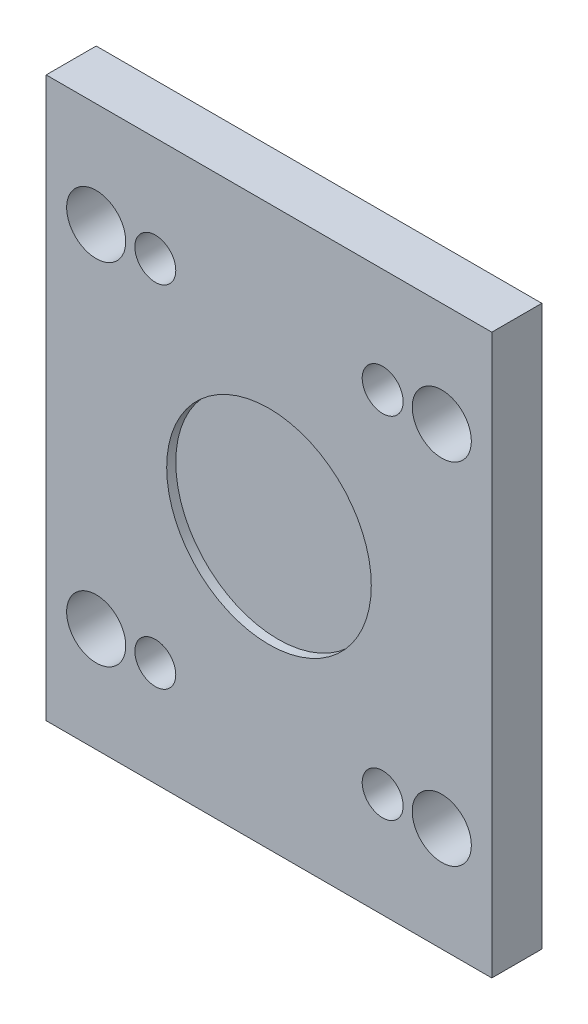
ISO-10303-21;
HEADER;
FILE_DESCRIPTION(('STEP AP214'),'2;1');
FILE_NAME('part.step','',(''),(''),'','','');
FILE_SCHEMA(('AUTOMOTIVE_DESIGN { 1 0 10303 214 1 1 1 1 }'));
ENDSEC;
DATA;
#1=APPLICATION_CONTEXT('core data for automotive mechanical design processes');
#2=APPLICATION_PROTOCOL_DEFINITION('international standard','automotive_design',2000,#1);
#3=PRODUCT_CONTEXT('',#1,'mechanical');
#4=PRODUCT('Part','Part','',(#3));
#5=PRODUCT_RELATED_PRODUCT_CATEGORY('part','',(#4));
#6=PRODUCT_DEFINITION_FORMATION('','',#4);
#7=PRODUCT_DEFINITION_CONTEXT('part definition',#1,'design');
#8=PRODUCT_DEFINITION('design','',#6,#7);
#9=PRODUCT_DEFINITION_SHAPE('','',#8);
#10=(LENGTH_UNIT() NAMED_UNIT(*) SI_UNIT(.MILLI.,.METRE.));
#11=(NAMED_UNIT(*) PLANE_ANGLE_UNIT() SI_UNIT($,.RADIAN.));
#12=(NAMED_UNIT(*) SI_UNIT($,.STERADIAN.) SOLID_ANGLE_UNIT());
#13=UNCERTAINTY_MEASURE_WITH_UNIT(LENGTH_MEASURE(1.E-05),#10,'distance_accuracy_value','');
#14=(GEOMETRIC_REPRESENTATION_CONTEXT(3) GLOBAL_UNCERTAINTY_ASSIGNED_CONTEXT((#13)) GLOBAL_UNIT_ASSIGNED_CONTEXT((#10,
#11,#12)) REPRESENTATION_CONTEXT('',''));
#15=CARTESIAN_POINT('',(0.,0.,0.));
#16=DIRECTION('',(0.,0.,1.));
#17=DIRECTION('',(1.,0.,0.));
#18=AXIS2_PLACEMENT_3D('',#15,#16,#17);
#19=CARTESIAN_POINT('',(98.,-123.,0.));
#20=DIRECTION('',(1.,0.,0.));
#21=DIRECTION('',(0.,0.,-1.));
#22=AXIS2_PLACEMENT_3D('',#19,#20,#21);
#23=PLANE('',#22);
#24=DIRECTION('',(0.,1.,0.));
#25=VECTOR('',#24,1.);
#26=CARTESIAN_POINT('',(98.,-123.,22.));
#27=LINE('',#26,#25);
#28=CARTESIAN_POINT('',(98.,-123.,22.));
#29=VERTEX_POINT('',#28);
#30=CARTESIAN_POINT('',(98.,123.,22.));
#31=VERTEX_POINT('',#30);
#32=EDGE_CURVE('E102',#29,#31,#27,.T.);
#33=ORIENTED_EDGE('',*,*,#32,.F.);
#34=DIRECTION('',(0.,0.,1.));
#35=VECTOR('',#34,1.);
#36=CARTESIAN_POINT('',(98.,-123.,0.));
#37=LINE('',#36,#35);
#38=CARTESIAN_POINT('',(98.,-123.,0.));
#39=VERTEX_POINT('',#38);
#40=EDGE_CURVE('E11',#39,#29,#37,.T.);
#41=ORIENTED_EDGE('',*,*,#40,.F.);
#42=DIRECTION('',(0.,1.,0.));
#43=VECTOR('',#42,1.);
#44=CARTESIAN_POINT('',(98.,-123.,0.));
#45=LINE('',#44,#43);
#46=CARTESIAN_POINT('',(98.,123.,0.));
#47=VERTEX_POINT('',#46);
#48=EDGE_CURVE('E95',#39,#47,#45,.T.);
#49=ORIENTED_EDGE('',*,*,#48,.T.);
#50=DIRECTION('',(0.,0.,1.));
#51=VECTOR('',#50,1.);
#52=CARTESIAN_POINT('',(98.,123.,0.));
#53=LINE('',#52,#51);
#54=EDGE_CURVE('E40',#47,#31,#53,.T.);
#55=ORIENTED_EDGE('',*,*,#54,.T.);
#56=EDGE_LOOP('',(#33,#41,#49,#55));
#57=FACE_BOUND('',#56,.T.);
#58=ADVANCED_FACE('F37',(#57),#23,.T.);
#59=CARTESIAN_POINT('',(-98.,-123.,0.));
#60=DIRECTION('',(0.,-1.,0.));
#61=DIRECTION('',(0.,0.,-1.));
#62=AXIS2_PLACEMENT_3D('',#59,#60,#61);
#63=PLANE('',#62);
#64=DIRECTION('',(1.,0.,0.));
#65=VECTOR('',#64,1.);
#66=CARTESIAN_POINT('',(-98.,-123.,22.));
#67=LINE('',#66,#65);
#68=CARTESIAN_POINT('',(-98.,-123.,22.));
#69=VERTEX_POINT('',#68);
#70=EDGE_CURVE('E97',#69,#29,#67,.T.);
#71=ORIENTED_EDGE('',*,*,#70,.F.);
#72=DIRECTION('',(0.,0.,1.));
#73=VECTOR('',#72,1.);
#74=CARTESIAN_POINT('',(-98.,-123.,0.));
#75=LINE('',#74,#73);
#76=CARTESIAN_POINT('',(-98.,-123.,0.));
#77=VERTEX_POINT('',#76);
#78=EDGE_CURVE('E46',#77,#69,#75,.T.);
#79=ORIENTED_EDGE('',*,*,#78,.F.);
#80=DIRECTION('',(1.,0.,0.));
#81=VECTOR('',#80,1.);
#82=CARTESIAN_POINT('',(-98.,-123.,0.));
#83=LINE('',#82,#81);
#84=EDGE_CURVE('E92',#77,#39,#83,.T.);
#85=ORIENTED_EDGE('',*,*,#84,.T.);
#86=ORIENTED_EDGE('',*,*,#40,.T.);
#87=EDGE_LOOP('',(#71,#79,#85,#86));
#88=FACE_BOUND('',#87,.T.);
#89=ADVANCED_FACE('F113',(#88),#63,.T.);
#90=CARTESIAN_POINT('',(-98.,123.,0.));
#91=DIRECTION('',(-1.,0.,0.));
#92=DIRECTION('',(0.,0.,1.));
#93=AXIS2_PLACEMENT_3D('',#90,#91,#92);
#94=PLANE('',#93);
#95=DIRECTION('',(0.,-1.,0.));
#96=VECTOR('',#95,1.);
#97=CARTESIAN_POINT('',(-98.,123.,22.));
#98=LINE('',#97,#96);
#99=CARTESIAN_POINT('',(-98.,123.,22.));
#100=VERTEX_POINT('',#99);
#101=EDGE_CURVE('E87',#100,#69,#98,.T.);
#102=ORIENTED_EDGE('',*,*,#101,.F.);
#103=DIRECTION('',(0.,0.,1.));
#104=VECTOR('',#103,1.);
#105=CARTESIAN_POINT('',(-98.,123.,0.));
#106=LINE('',#105,#104);
#107=CARTESIAN_POINT('',(-98.,123.,0.));
#108=VERTEX_POINT('',#107);
#109=EDGE_CURVE('E82',#108,#100,#106,.T.);
#110=ORIENTED_EDGE('',*,*,#109,.F.);
#111=DIRECTION('',(0.,-1.,0.));
#112=VECTOR('',#111,1.);
#113=CARTESIAN_POINT('',(-98.,123.,0.));
#114=LINE('',#113,#112);
#115=EDGE_CURVE('E85',#108,#77,#114,.T.);
#116=ORIENTED_EDGE('',*,*,#115,.T.);
#117=ORIENTED_EDGE('',*,*,#78,.T.);
#118=EDGE_LOOP('',(#102,#110,#116,#117));
#119=FACE_BOUND('',#118,.T.);
#120=ADVANCED_FACE('F84',(#119),#94,.T.);
#121=CARTESIAN_POINT('',(98.,123.,0.));
#122=DIRECTION('',(0.,1.,0.));
#123=DIRECTION('',(0.,0.,1.));
#124=AXIS2_PLACEMENT_3D('',#121,#122,#123);
#125=PLANE('',#124);
#126=DIRECTION('',(-1.,0.,0.));
#127=VECTOR('',#126,1.);
#128=CARTESIAN_POINT('',(98.,123.,22.));
#129=LINE('',#128,#127);
#130=EDGE_CURVE('E105',#31,#100,#129,.T.);
#131=ORIENTED_EDGE('',*,*,#130,.F.);
#132=ORIENTED_EDGE('',*,*,#54,.F.);
#133=DIRECTION('',(-1.,0.,0.));
#134=VECTOR('',#133,1.);
#135=CARTESIAN_POINT('',(98.,123.,0.));
#136=LINE('',#135,#134);
#137=EDGE_CURVE('E91',#47,#108,#136,.T.);
#138=ORIENTED_EDGE('',*,*,#137,.T.);
#139=ORIENTED_EDGE('',*,*,#109,.T.);
#140=EDGE_LOOP('',(#131,#132,#138,#139));
#141=FACE_BOUND('',#140,.T.);
#142=ADVANCED_FACE('F94',(#141),#125,.T.);
#143=CARTESIAN_POINT('',(0.,0.,0.));
#144=DIRECTION('',(0.,0.,1.));
#145=DIRECTION('',(1.,0.,0.));
#146=AXIS2_PLACEMENT_3D('',#143,#144,#145);
#147=PLANE('',#146);
#148=CARTESIAN_POINT('',(76.,77.,0.));
#149=DIRECTION('',(0.,0.,1.));
#150=DIRECTION('',(1.,0.,0.));
#151=AXIS2_PLACEMENT_3D('',#148,#149,#150);
#152=CIRCLE('',#151,13.);
#153=CARTESIAN_POINT('',(89.,77.,0.));
#154=VERTEX_POINT('',#153);
#155=EDGE_CURVE('E221',#154,#154,#152,.T.);
#156=ORIENTED_EDGE('',*,*,#155,.T.);
#157=EDGE_LOOP('',(#156));
#158=FACE_BOUND('',#157,.T.);
#159=CARTESIAN_POINT('',(76.,-77.,0.));
#160=DIRECTION('',(0.,0.,1.));
#161=DIRECTION('',(1.,0.,0.));
#162=AXIS2_PLACEMENT_3D('',#159,#160,#161);
#163=CIRCLE('',#162,13.);
#164=CARTESIAN_POINT('',(89.,-77.,0.));
#165=VERTEX_POINT('',#164);
#166=EDGE_CURVE('E226',#165,#165,#163,.T.);
#167=ORIENTED_EDGE('',*,*,#166,.T.);
#168=EDGE_LOOP('',(#167));
#169=FACE_BOUND('',#168,.T.);
#170=CARTESIAN_POINT('',(-76.,-77.,0.));
#171=DIRECTION('',(0.,0.,1.));
#172=DIRECTION('',(1.,0.,0.));
#173=AXIS2_PLACEMENT_3D('',#170,#171,#172);
#174=CIRCLE('',#173,13.);
#175=CARTESIAN_POINT('',(-63.,-77.,0.));
#176=VERTEX_POINT('',#175);
#177=EDGE_CURVE('E232',#176,#176,#174,.T.);
#178=ORIENTED_EDGE('',*,*,#177,.T.);
#179=EDGE_LOOP('',(#178));
#180=FACE_BOUND('',#179,.T.);
#181=CARTESIAN_POINT('',(-76.,77.,0.));
#182=DIRECTION('',(0.,0.,1.));
#183=DIRECTION('',(1.,0.,0.));
#184=AXIS2_PLACEMENT_3D('',#181,#182,#183);
#185=CIRCLE('',#184,13.);
#186=CARTESIAN_POINT('',(-63.,77.,0.));
#187=VERTEX_POINT('',#186);
#188=EDGE_CURVE('E238',#187,#187,#185,.T.);
#189=ORIENTED_EDGE('',*,*,#188,.T.);
#190=EDGE_LOOP('',(#189));
#191=FACE_BOUND('',#190,.T.);
#192=CARTESIAN_POINT('',(50.,77.,0.));
#193=DIRECTION('',(0.,0.,1.));
#194=DIRECTION('',(1.,0.,0.));
#195=AXIS2_PLACEMENT_3D('',#192,#193,#194);
#196=CIRCLE('',#195,5.50000000000001);
#197=CARTESIAN_POINT('',(55.5,77.,0.));
#198=VERTEX_POINT('',#197);
#199=EDGE_CURVE('E250',#198,#198,#196,.T.);
#200=ORIENTED_EDGE('',*,*,#199,.T.);
#201=EDGE_LOOP('',(#200));
#202=FACE_BOUND('',#201,.T.);
#203=CARTESIAN_POINT('',(50.,-77.,0.));
#204=DIRECTION('',(0.,0.,1.));
#205=DIRECTION('',(1.,0.,0.));
#206=AXIS2_PLACEMENT_3D('',#203,#204,#205);
#207=CIRCLE('',#206,5.50000000000001);
#208=CARTESIAN_POINT('',(55.5,-77.,0.));
#209=VERTEX_POINT('',#208);
#210=EDGE_CURVE('E262',#209,#209,#207,.T.);
#211=ORIENTED_EDGE('',*,*,#210,.T.);
#212=EDGE_LOOP('',(#211));
#213=FACE_BOUND('',#212,.T.);
#214=CARTESIAN_POINT('',(-50.,77.,0.));
#215=DIRECTION('',(0.,0.,1.));
#216=DIRECTION('',(1.,0.,0.));
#217=AXIS2_PLACEMENT_3D('',#214,#215,#216);
#218=CIRCLE('',#217,5.50000000000001);
#219=CARTESIAN_POINT('',(-44.5,77.,0.));
#220=VERTEX_POINT('',#219);
#221=EDGE_CURVE('E274',#220,#220,#218,.T.);
#222=ORIENTED_EDGE('',*,*,#221,.T.);
#223=EDGE_LOOP('',(#222));
#224=FACE_BOUND('',#223,.T.);
#225=CARTESIAN_POINT('',(-50.,-77.,0.));
#226=DIRECTION('',(0.,0.,1.));
#227=DIRECTION('',(1.,0.,0.));
#228=AXIS2_PLACEMENT_3D('',#225,#226,#227);
#229=CIRCLE('',#228,5.50000000000001);
#230=CARTESIAN_POINT('',(-44.5,-77.,0.));
#231=VERTEX_POINT('',#230);
#232=EDGE_CURVE('E106',#231,#231,#229,.T.);
#233=ORIENTED_EDGE('',*,*,#232,.T.);
#234=EDGE_LOOP('',(#233));
#235=FACE_BOUND('',#234,.T.);
#236=ORIENTED_EDGE('',*,*,#48,.F.);
#237=ORIENTED_EDGE('',*,*,#84,.F.);
#238=ORIENTED_EDGE('',*,*,#115,.F.);
#239=ORIENTED_EDGE('',*,*,#137,.F.);
#240=EDGE_LOOP('',(#236,#237,#238,#239));
#241=FACE_BOUND('',#240,.T.);
#242=ADVANCED_FACE('F90',(#158,#169,#180,#191,#202,#213,#224,#235,#241),#147,.F.);
#243=CARTESIAN_POINT('',(0.,0.,22.));
#244=DIRECTION('',(0.,0.,1.));
#245=DIRECTION('',(1.,0.,0.));
#246=AXIS2_PLACEMENT_3D('',#243,#244,#245);
#247=PLANE('',#246);
#248=CARTESIAN_POINT('',(0.,0.,22.));
#249=DIRECTION('',(0.,0.,1.));
#250=DIRECTION('',(1.,0.,0.));
#251=AXIS2_PLACEMENT_3D('',#248,#249,#250);
#252=CIRCLE('',#251,45.);
#253=CARTESIAN_POINT('',(45.,0.,22.));
#254=VERTEX_POINT('',#253);
#255=EDGE_CURVE('E214',#254,#254,#252,.T.);
#256=ORIENTED_EDGE('',*,*,#255,.F.);
#257=EDGE_LOOP('',(#256));
#258=FACE_BOUND('',#257,.T.);
#259=CARTESIAN_POINT('',(76.,77.,22.));
#260=DIRECTION('',(0.,0.,1.));
#261=DIRECTION('',(1.,0.,0.));
#262=AXIS2_PLACEMENT_3D('',#259,#260,#261);
#263=CIRCLE('',#262,13.);
#264=CARTESIAN_POINT('',(89.,77.,22.));
#265=VERTEX_POINT('',#264);
#266=EDGE_CURVE('E216',#265,#265,#263,.T.);
#267=ORIENTED_EDGE('',*,*,#266,.F.);
#268=EDGE_LOOP('',(#267));
#269=FACE_BOUND('',#268,.T.);
#270=CARTESIAN_POINT('',(76.,-77.,22.));
#271=DIRECTION('',(0.,0.,1.));
#272=DIRECTION('',(1.,0.,0.));
#273=AXIS2_PLACEMENT_3D('',#270,#271,#272);
#274=CIRCLE('',#273,13.);
#275=CARTESIAN_POINT('',(89.,-77.,22.));
#276=VERTEX_POINT('',#275);
#277=EDGE_CURVE('E223',#276,#276,#274,.T.);
#278=ORIENTED_EDGE('',*,*,#277,.F.);
#279=EDGE_LOOP('',(#278));
#280=FACE_BOUND('',#279,.T.);
#281=CARTESIAN_POINT('',(-76.,-77.,22.));
#282=DIRECTION('',(0.,0.,1.));
#283=DIRECTION('',(1.,0.,0.));
#284=AXIS2_PLACEMENT_3D('',#281,#282,#283);
#285=CIRCLE('',#284,13.);
#286=CARTESIAN_POINT('',(-63.,-77.,22.));
#287=VERTEX_POINT('',#286);
#288=EDGE_CURVE('E229',#287,#287,#285,.T.);
#289=ORIENTED_EDGE('',*,*,#288,.F.);
#290=EDGE_LOOP('',(#289));
#291=FACE_BOUND('',#290,.T.);
#292=CARTESIAN_POINT('',(-76.,77.,22.));
#293=DIRECTION('',(0.,0.,1.));
#294=DIRECTION('',(1.,0.,0.));
#295=AXIS2_PLACEMENT_3D('',#292,#293,#294);
#296=CIRCLE('',#295,13.);
#297=CARTESIAN_POINT('',(-63.,77.,22.));
#298=VERTEX_POINT('',#297);
#299=EDGE_CURVE('E235',#298,#298,#296,.T.);
#300=ORIENTED_EDGE('',*,*,#299,.F.);
#301=EDGE_LOOP('',(#300));
#302=FACE_BOUND('',#301,.T.);
#303=CARTESIAN_POINT('',(50.,77.,22.));
#304=DIRECTION('',(0.,0.,1.));
#305=DIRECTION('',(1.,0.,0.));
#306=AXIS2_PLACEMENT_3D('',#303,#304,#305);
#307=CIRCLE('',#306,8.99999999999999);
#308=CARTESIAN_POINT('',(59.,77.,22.));
#309=VERTEX_POINT('',#308);
#310=EDGE_CURVE('E241',#309,#309,#307,.T.);
#311=ORIENTED_EDGE('',*,*,#310,.F.);
#312=EDGE_LOOP('',(#311));
#313=FACE_BOUND('',#312,.T.);
#314=CARTESIAN_POINT('',(50.,-77.,22.));
#315=DIRECTION('',(0.,0.,1.));
#316=DIRECTION('',(1.,0.,0.));
#317=AXIS2_PLACEMENT_3D('',#314,#315,#316);
#318=CIRCLE('',#317,8.99999999999999);
#319=CARTESIAN_POINT('',(59.,-77.,22.));
#320=VERTEX_POINT('',#319);
#321=EDGE_CURVE('E253',#320,#320,#318,.T.);
#322=ORIENTED_EDGE('',*,*,#321,.F.);
#323=EDGE_LOOP('',(#322));
#324=FACE_BOUND('',#323,.T.);
#325=CARTESIAN_POINT('',(-50.,77.,22.));
#326=DIRECTION('',(0.,0.,1.));
#327=DIRECTION('',(1.,0.,0.));
#328=AXIS2_PLACEMENT_3D('',#325,#326,#327);
#329=CIRCLE('',#328,8.99999999999999);
#330=CARTESIAN_POINT('',(-41.,77.,22.));
#331=VERTEX_POINT('',#330);
#332=EDGE_CURVE('E265',#331,#331,#329,.T.);
#333=ORIENTED_EDGE('',*,*,#332,.F.);
#334=EDGE_LOOP('',(#333));
#335=FACE_BOUND('',#334,.T.);
#336=CARTESIAN_POINT('',(-50.,-77.,22.));
#337=DIRECTION('',(0.,0.,1.));
#338=DIRECTION('',(1.,0.,0.));
#339=AXIS2_PLACEMENT_3D('',#336,#337,#338);
#340=CIRCLE('',#339,8.99999999999999);
#341=CARTESIAN_POINT('',(-41.,-77.,22.));
#342=VERTEX_POINT('',#341);
#343=EDGE_CURVE('E277',#342,#342,#340,.T.);
#344=ORIENTED_EDGE('',*,*,#343,.F.);
#345=EDGE_LOOP('',(#344));
#346=FACE_BOUND('',#345,.T.);
#347=ORIENTED_EDGE('',*,*,#32,.T.);
#348=ORIENTED_EDGE('',*,*,#130,.T.);
#349=ORIENTED_EDGE('',*,*,#101,.T.);
#350=ORIENTED_EDGE('',*,*,#70,.T.);
#351=EDGE_LOOP('',(#347,#348,#349,#350));
#352=FACE_BOUND('',#351,.T.);
#353=ADVANCED_FACE('F112',(#258,#269,#280,#291,#302,#313,#324,#335,#346,#352),#247,.T.);
#354=CARTESIAN_POINT('',(-50.,-77.,22.));
#355=DIRECTION('',(0.,0.,1.));
#356=DIRECTION('',(1.,0.,0.));
#357=AXIS2_PLACEMENT_3D('',#354,#355,#356);
#358=CYLINDRICAL_SURFACE('',#357,5.50000000000001);
#359=ORIENTED_EDGE('',*,*,#232,.F.);
#360=EDGE_LOOP('',(#359));
#361=FACE_BOUND('',#360,.T.);
#362=CARTESIAN_POINT('',(-50.,-77.,9.));
#363=DIRECTION('',(0.,0.,1.));
#364=DIRECTION('',(1.,0.,0.));
#365=AXIS2_PLACEMENT_3D('',#362,#363,#364);
#366=CIRCLE('',#365,5.50000000000001);
#367=CARTESIAN_POINT('',(-44.5,-77.,9.));
#368=VERTEX_POINT('',#367);
#369=EDGE_CURVE('E283',#368,#368,#366,.T.);
#370=ORIENTED_EDGE('',*,*,#369,.T.);
#371=EDGE_LOOP('',(#370));
#372=FACE_BOUND('',#371,.T.);
#373=ADVANCED_FACE('F131',(#361,#372),#358,.F.);
#374=CARTESIAN_POINT('',(-44.5,-77.,9.));
#375=DIRECTION('',(0.,0.,-1.));
#376=DIRECTION('',(-1.,0.,0.));
#377=AXIS2_PLACEMENT_3D('',#374,#375,#376);
#378=PLANE('',#377);
#379=ORIENTED_EDGE('',*,*,#369,.F.);
#380=EDGE_LOOP('',(#379));
#381=FACE_BOUND('',#380,.T.);
#382=CARTESIAN_POINT('',(-50.,-77.,9.));
#383=DIRECTION('',(0.,0.,1.));
#384=DIRECTION('',(1.,0.,0.));
#385=AXIS2_PLACEMENT_3D('',#382,#383,#384);
#386=CIRCLE('',#385,8.99999999999999);
#387=CARTESIAN_POINT('',(-41.,-77.,9.));
#388=VERTEX_POINT('',#387);
#389=EDGE_CURVE('E280',#388,#388,#386,.T.);
#390=ORIENTED_EDGE('',*,*,#389,.T.);
#391=EDGE_LOOP('',(#390));
#392=FACE_BOUND('',#391,.T.);
#393=ADVANCED_FACE('F138',(#381,#392),#378,.F.);
#394=CARTESIAN_POINT('',(-50.,-77.,22.));
#395=DIRECTION('',(0.,0.,1.));
#396=DIRECTION('',(1.,0.,0.));
#397=AXIS2_PLACEMENT_3D('',#394,#395,#396);
#398=CYLINDRICAL_SURFACE('',#397,8.99999999999999);
#399=ORIENTED_EDGE('',*,*,#389,.F.);
#400=EDGE_LOOP('',(#399));
#401=FACE_BOUND('',#400,.T.);
#402=ORIENTED_EDGE('',*,*,#343,.T.);
#403=EDGE_LOOP('',(#402));
#404=FACE_BOUND('',#403,.T.);
#405=ADVANCED_FACE('F142',(#401,#404),#398,.F.);
#406=CARTESIAN_POINT('',(-50.,77.,22.));
#407=DIRECTION('',(0.,0.,1.));
#408=DIRECTION('',(1.,0.,0.));
#409=AXIS2_PLACEMENT_3D('',#406,#407,#408);
#410=CYLINDRICAL_SURFACE('',#409,5.50000000000001);
#411=ORIENTED_EDGE('',*,*,#221,.F.);
#412=EDGE_LOOP('',(#411));
#413=FACE_BOUND('',#412,.T.);
#414=CARTESIAN_POINT('',(-50.,77.,9.));
#415=DIRECTION('',(0.,0.,1.));
#416=DIRECTION('',(1.,0.,0.));
#417=AXIS2_PLACEMENT_3D('',#414,#415,#416);
#418=CIRCLE('',#417,5.50000000000001);
#419=CARTESIAN_POINT('',(-44.5,77.,9.));
#420=VERTEX_POINT('',#419);
#421=EDGE_CURVE('E271',#420,#420,#418,.T.);
#422=ORIENTED_EDGE('',*,*,#421,.T.);
#423=EDGE_LOOP('',(#422));
#424=FACE_BOUND('',#423,.T.);
#425=ADVANCED_FACE('F146',(#413,#424),#410,.F.);
#426=CARTESIAN_POINT('',(-44.5,77.,9.));
#427=DIRECTION('',(0.,0.,-1.));
#428=DIRECTION('',(-1.,0.,0.));
#429=AXIS2_PLACEMENT_3D('',#426,#427,#428);
#430=PLANE('',#429);
#431=ORIENTED_EDGE('',*,*,#421,.F.);
#432=EDGE_LOOP('',(#431));
#433=FACE_BOUND('',#432,.T.);
#434=CARTESIAN_POINT('',(-50.,77.,9.));
#435=DIRECTION('',(0.,0.,1.));
#436=DIRECTION('',(1.,0.,0.));
#437=AXIS2_PLACEMENT_3D('',#434,#435,#436);
#438=CIRCLE('',#437,8.99999999999999);
#439=CARTESIAN_POINT('',(-41.,77.,9.));
#440=VERTEX_POINT('',#439);
#441=EDGE_CURVE('E268',#440,#440,#438,.T.);
#442=ORIENTED_EDGE('',*,*,#441,.T.);
#443=EDGE_LOOP('',(#442));
#444=FACE_BOUND('',#443,.T.);
#445=ADVANCED_FACE('F150',(#433,#444),#430,.F.);
#446=CARTESIAN_POINT('',(-50.,77.,22.));
#447=DIRECTION('',(0.,0.,1.));
#448=DIRECTION('',(1.,0.,0.));
#449=AXIS2_PLACEMENT_3D('',#446,#447,#448);
#450=CYLINDRICAL_SURFACE('',#449,8.99999999999999);
#451=ORIENTED_EDGE('',*,*,#441,.F.);
#452=EDGE_LOOP('',(#451));
#453=FACE_BOUND('',#452,.T.);
#454=ORIENTED_EDGE('',*,*,#332,.T.);
#455=EDGE_LOOP('',(#454));
#456=FACE_BOUND('',#455,.T.);
#457=ADVANCED_FACE('F154',(#453,#456),#450,.F.);
#458=CARTESIAN_POINT('',(50.,-77.,22.));
#459=DIRECTION('',(0.,0.,1.));
#460=DIRECTION('',(1.,0.,0.));
#461=AXIS2_PLACEMENT_3D('',#458,#459,#460);
#462=CYLINDRICAL_SURFACE('',#461,5.50000000000001);
#463=ORIENTED_EDGE('',*,*,#210,.F.);
#464=EDGE_LOOP('',(#463));
#465=FACE_BOUND('',#464,.T.);
#466=CARTESIAN_POINT('',(50.,-77.,9.));
#467=DIRECTION('',(0.,0.,1.));
#468=DIRECTION('',(1.,0.,0.));
#469=AXIS2_PLACEMENT_3D('',#466,#467,#468);
#470=CIRCLE('',#469,5.50000000000001);
#471=CARTESIAN_POINT('',(55.5,-77.,9.));
#472=VERTEX_POINT('',#471);
#473=EDGE_CURVE('E259',#472,#472,#470,.T.);
#474=ORIENTED_EDGE('',*,*,#473,.T.);
#475=EDGE_LOOP('',(#474));
#476=FACE_BOUND('',#475,.T.);
#477=ADVANCED_FACE('F158',(#465,#476),#462,.F.);
#478=CARTESIAN_POINT('',(55.5,-77.,9.));
#479=DIRECTION('',(0.,0.,-1.));
#480=DIRECTION('',(-1.,0.,0.));
#481=AXIS2_PLACEMENT_3D('',#478,#479,#480);
#482=PLANE('',#481);
#483=ORIENTED_EDGE('',*,*,#473,.F.);
#484=EDGE_LOOP('',(#483));
#485=FACE_BOUND('',#484,.T.);
#486=CARTESIAN_POINT('',(50.,-77.,9.));
#487=DIRECTION('',(0.,0.,1.));
#488=DIRECTION('',(1.,0.,0.));
#489=AXIS2_PLACEMENT_3D('',#486,#487,#488);
#490=CIRCLE('',#489,8.99999999999999);
#491=CARTESIAN_POINT('',(59.,-77.,9.));
#492=VERTEX_POINT('',#491);
#493=EDGE_CURVE('E256',#492,#492,#490,.T.);
#494=ORIENTED_EDGE('',*,*,#493,.T.);
#495=EDGE_LOOP('',(#494));
#496=FACE_BOUND('',#495,.T.);
#497=ADVANCED_FACE('F162',(#485,#496),#482,.F.);
#498=CARTESIAN_POINT('',(50.,-77.,22.));
#499=DIRECTION('',(0.,0.,1.));
#500=DIRECTION('',(1.,0.,0.));
#501=AXIS2_PLACEMENT_3D('',#498,#499,#500);
#502=CYLINDRICAL_SURFACE('',#501,8.99999999999999);
#503=ORIENTED_EDGE('',*,*,#493,.F.);
#504=EDGE_LOOP('',(#503));
#505=FACE_BOUND('',#504,.T.);
#506=ORIENTED_EDGE('',*,*,#321,.T.);
#507=EDGE_LOOP('',(#506));
#508=FACE_BOUND('',#507,.T.);
#509=ADVANCED_FACE('F166',(#505,#508),#502,.F.);
#510=CARTESIAN_POINT('',(50.,77.,22.));
#511=DIRECTION('',(0.,0.,1.));
#512=DIRECTION('',(1.,0.,0.));
#513=AXIS2_PLACEMENT_3D('',#510,#511,#512);
#514=CYLINDRICAL_SURFACE('',#513,5.50000000000001);
#515=ORIENTED_EDGE('',*,*,#199,.F.);
#516=EDGE_LOOP('',(#515));
#517=FACE_BOUND('',#516,.T.);
#518=CARTESIAN_POINT('',(50.,77.,9.));
#519=DIRECTION('',(0.,0.,1.));
#520=DIRECTION('',(1.,0.,0.));
#521=AXIS2_PLACEMENT_3D('',#518,#519,#520);
#522=CIRCLE('',#521,5.50000000000001);
#523=CARTESIAN_POINT('',(55.5,77.,9.));
#524=VERTEX_POINT('',#523);
#525=EDGE_CURVE('E247',#524,#524,#522,.T.);
#526=ORIENTED_EDGE('',*,*,#525,.T.);
#527=EDGE_LOOP('',(#526));
#528=FACE_BOUND('',#527,.T.);
#529=ADVANCED_FACE('F170',(#517,#528),#514,.F.);
#530=CARTESIAN_POINT('',(55.5,77.,9.));
#531=DIRECTION('',(0.,0.,-1.));
#532=DIRECTION('',(-1.,0.,0.));
#533=AXIS2_PLACEMENT_3D('',#530,#531,#532);
#534=PLANE('',#533);
#535=ORIENTED_EDGE('',*,*,#525,.F.);
#536=EDGE_LOOP('',(#535));
#537=FACE_BOUND('',#536,.T.);
#538=CARTESIAN_POINT('',(50.,77.,9.));
#539=DIRECTION('',(0.,0.,1.));
#540=DIRECTION('',(1.,0.,0.));
#541=AXIS2_PLACEMENT_3D('',#538,#539,#540);
#542=CIRCLE('',#541,8.99999999999999);
#543=CARTESIAN_POINT('',(59.,77.,9.));
#544=VERTEX_POINT('',#543);
#545=EDGE_CURVE('E244',#544,#544,#542,.T.);
#546=ORIENTED_EDGE('',*,*,#545,.T.);
#547=EDGE_LOOP('',(#546));
#548=FACE_BOUND('',#547,.T.);
#549=ADVANCED_FACE('F174',(#537,#548),#534,.F.);
#550=CARTESIAN_POINT('',(50.,77.,22.));
#551=DIRECTION('',(0.,0.,1.));
#552=DIRECTION('',(1.,0.,0.));
#553=AXIS2_PLACEMENT_3D('',#550,#551,#552);
#554=CYLINDRICAL_SURFACE('',#553,8.99999999999999);
#555=ORIENTED_EDGE('',*,*,#545,.F.);
#556=EDGE_LOOP('',(#555));
#557=FACE_BOUND('',#556,.T.);
#558=ORIENTED_EDGE('',*,*,#310,.T.);
#559=EDGE_LOOP('',(#558));
#560=FACE_BOUND('',#559,.T.);
#561=ADVANCED_FACE('F178',(#557,#560),#554,.F.);
#562=CARTESIAN_POINT('',(-76.,77.,22.));
#563=DIRECTION('',(0.,0.,1.));
#564=DIRECTION('',(1.,0.,0.));
#565=AXIS2_PLACEMENT_3D('',#562,#563,#564);
#566=CYLINDRICAL_SURFACE('',#565,13.);
#567=ORIENTED_EDGE('',*,*,#188,.F.);
#568=EDGE_LOOP('',(#567));
#569=FACE_BOUND('',#568,.T.);
#570=ORIENTED_EDGE('',*,*,#299,.T.);
#571=EDGE_LOOP('',(#570));
#572=FACE_BOUND('',#571,.T.);
#573=ADVANCED_FACE('F182',(#569,#572),#566,.F.);
#574=CARTESIAN_POINT('',(-76.,-77.,22.));
#575=DIRECTION('',(0.,0.,1.));
#576=DIRECTION('',(1.,0.,0.));
#577=AXIS2_PLACEMENT_3D('',#574,#575,#576);
#578=CYLINDRICAL_SURFACE('',#577,13.);
#579=ORIENTED_EDGE('',*,*,#177,.F.);
#580=EDGE_LOOP('',(#579));
#581=FACE_BOUND('',#580,.T.);
#582=ORIENTED_EDGE('',*,*,#288,.T.);
#583=EDGE_LOOP('',(#582));
#584=FACE_BOUND('',#583,.T.);
#585=ADVANCED_FACE('F186',(#581,#584),#578,.F.);
#586=CARTESIAN_POINT('',(76.,-77.,22.));
#587=DIRECTION('',(0.,0.,1.));
#588=DIRECTION('',(1.,0.,0.));
#589=AXIS2_PLACEMENT_3D('',#586,#587,#588);
#590=CYLINDRICAL_SURFACE('',#589,13.);
#591=ORIENTED_EDGE('',*,*,#166,.F.);
#592=EDGE_LOOP('',(#591));
#593=FACE_BOUND('',#592,.T.);
#594=ORIENTED_EDGE('',*,*,#277,.T.);
#595=EDGE_LOOP('',(#594));
#596=FACE_BOUND('',#595,.T.);
#597=ADVANCED_FACE('F190',(#593,#596),#590,.F.);
#598=CARTESIAN_POINT('',(76.,77.,22.));
#599=DIRECTION('',(0.,0.,1.));
#600=DIRECTION('',(1.,0.,0.));
#601=AXIS2_PLACEMENT_3D('',#598,#599,#600);
#602=CYLINDRICAL_SURFACE('',#601,13.);
#603=ORIENTED_EDGE('',*,*,#155,.F.);
#604=EDGE_LOOP('',(#603));
#605=FACE_BOUND('',#604,.T.);
#606=ORIENTED_EDGE('',*,*,#266,.T.);
#607=EDGE_LOOP('',(#606));
#608=FACE_BOUND('',#607,.T.);
#609=ADVANCED_FACE('F194',(#605,#608),#602,.F.);
#610=CARTESIAN_POINT('',(0.,0.,18.0000000000001));
#611=DIRECTION('',(0.,0.,-1.));
#612=DIRECTION('',(-1.,0.,0.));
#613=AXIS2_PLACEMENT_3D('',#610,#611,#612);
#614=PLANE('',#613);
#615=CARTESIAN_POINT('',(0.,0.,18.));
#616=DIRECTION('',(0.,0.,1.));
#617=DIRECTION('',(1.,0.,0.));
#618=AXIS2_PLACEMENT_3D('',#615,#616,#617);
#619=CIRCLE('',#618,45.);
#620=CARTESIAN_POINT('',(45.,0.,18.));
#621=VERTEX_POINT('',#620);
#622=EDGE_CURVE('E211',#621,#621,#619,.T.);
#623=ORIENTED_EDGE('',*,*,#622,.T.);
#624=EDGE_LOOP('',(#623));
#625=FACE_BOUND('',#624,.T.);
#626=ADVANCED_FACE('F198',(#625),#614,.F.);
#627=CARTESIAN_POINT('',(0.,0.,22.));
#628=DIRECTION('',(0.,0.,1.));
#629=DIRECTION('',(1.,0.,0.));
#630=AXIS2_PLACEMENT_3D('',#627,#628,#629);
#631=CYLINDRICAL_SURFACE('',#630,45.);
#632=ORIENTED_EDGE('',*,*,#622,.F.);
#633=EDGE_LOOP('',(#632));
#634=FACE_BOUND('',#633,.T.);
#635=ORIENTED_EDGE('',*,*,#255,.T.);
#636=EDGE_LOOP('',(#635));
#637=FACE_BOUND('',#636,.T.);
#638=ADVANCED_FACE('F202',(#634,#637),#631,.F.);
#639=CLOSED_SHELL('',(#58,#89,#120,#142,#242,#353,#373,#393,#405,#425,#445,#457,#477,#497,#509,
#529,#549,#561,#573,#585,#597,#609,#626,#638));
#640=MANIFOLD_SOLID_BREP('B2',#639);
#641=ADVANCED_BREP_SHAPE_REPRESENTATION('',(#18,#640),#14);
#642=SHAPE_DEFINITION_REPRESENTATION(#9,#641);
ENDSEC;
END-ISO-10303-21;
